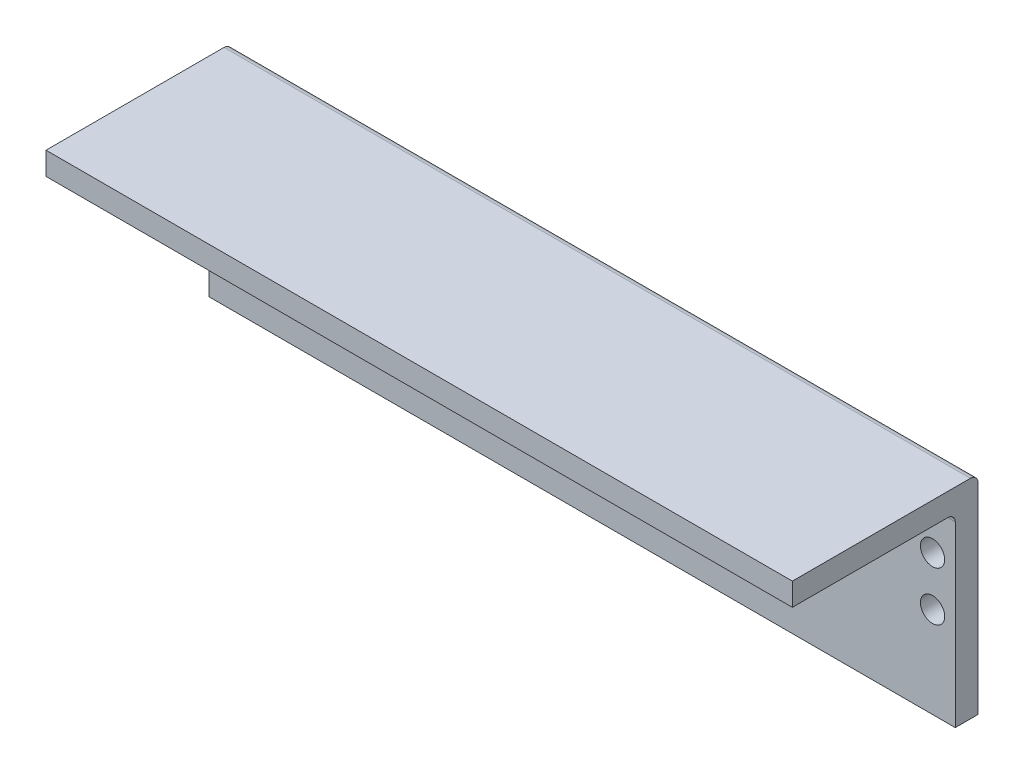
ISO-10303-21;
HEADER;
FILE_DESCRIPTION(('STEP AP214'),'2;1');
FILE_NAME('part.step','',(''),(''),'','','');
FILE_SCHEMA(('AUTOMOTIVE_DESIGN { 1 0 10303 214 1 1 1 1 }'));
ENDSEC;
DATA;
#1=APPLICATION_CONTEXT('core data for automotive mechanical design processes');
#2=APPLICATION_PROTOCOL_DEFINITION('international standard','automotive_design',2000,#1);
#3=PRODUCT_CONTEXT('',#1,'mechanical');
#4=PRODUCT('Part','Part','',(#3));
#5=PRODUCT_RELATED_PRODUCT_CATEGORY('part','',(#4));
#6=PRODUCT_DEFINITION_FORMATION('','',#4);
#7=PRODUCT_DEFINITION_CONTEXT('part definition',#1,'design');
#8=PRODUCT_DEFINITION('design','',#6,#7);
#9=PRODUCT_DEFINITION_SHAPE('','',#8);
#10=(LENGTH_UNIT() NAMED_UNIT(*) SI_UNIT(.MILLI.,.METRE.));
#11=(NAMED_UNIT(*) PLANE_ANGLE_UNIT() SI_UNIT($,.RADIAN.));
#12=(NAMED_UNIT(*) SI_UNIT($,.STERADIAN.) SOLID_ANGLE_UNIT());
#13=UNCERTAINTY_MEASURE_WITH_UNIT(LENGTH_MEASURE(1.E-05),#10,'distance_accuracy_value','');
#14=(GEOMETRIC_REPRESENTATION_CONTEXT(3) GLOBAL_UNCERTAINTY_ASSIGNED_CONTEXT((#13)) GLOBAL_UNIT_ASSIGNED_CONTEXT((#10,
#11,#12)) REPRESENTATION_CONTEXT('',''));
#15=CARTESIAN_POINT('',(0.,0.,0.));
#16=DIRECTION('',(0.,0.,1.));
#17=DIRECTION('',(1.,0.,0.));
#18=AXIS2_PLACEMENT_3D('',#15,#16,#17);
#19=CARTESIAN_POINT('',(0.,0.,3.));
#20=DIRECTION('',(0.,0.,-1.));
#21=DIRECTION('',(-1.,0.,0.));
#22=AXIS2_PLACEMENT_3D('',#19,#20,#21);
#23=PLANE('',#22);
#24=DIRECTION('',(0.,1.,0.));
#25=VECTOR('',#24,1.);
#26=CARTESIAN_POINT('',(49.2500000000016,0.,3.));
#27=LINE('',#26,#25);
#28=CARTESIAN_POINT('',(49.2500000000016,-9.,3.));
#29=VERTEX_POINT('',#28);
#30=CARTESIAN_POINT('',(49.2500000000016,14.5000000000001,3.));
#31=VERTEX_POINT('',#30);
#32=EDGE_CURVE('E202',#29,#31,#27,.T.);
#33=ORIENTED_EDGE('',*,*,#32,.T.);
#34=DIRECTION('',(-1.,0.,0.));
#35=VECTOR('',#34,1.);
#36=CARTESIAN_POINT('',(-49.2500000000016,14.5000000000001,3.));
#37=LINE('',#36,#35);
#38=CARTESIAN_POINT('',(-49.2500000000016,14.5000000000001,3.));
#39=VERTEX_POINT('',#38);
#40=EDGE_CURVE('E226',#31,#39,#37,.T.);
#41=ORIENTED_EDGE('',*,*,#40,.T.);
#42=DIRECTION('',(0.,-1.,0.));
#43=VECTOR('',#42,1.);
#44=CARTESIAN_POINT('',(-49.2500000000016,0.,3.));
#45=LINE('',#44,#43);
#46=CARTESIAN_POINT('',(-49.2500000000016,-9.,3.));
#47=VERTEX_POINT('',#46);
#48=EDGE_CURVE('E199',#39,#47,#45,.T.);
#49=ORIENTED_EDGE('',*,*,#48,.T.);
#50=DIRECTION('',(-1.,0.,0.));
#51=VECTOR('',#50,1.);
#52=CARTESIAN_POINT('',(49.2500000000016,-9.,3.));
#53=LINE('',#52,#51);
#54=EDGE_CURVE('E138',#29,#47,#53,.T.);
#55=ORIENTED_EDGE('',*,*,#54,.F.);
#56=EDGE_LOOP('',(#33,#41,#49,#55));
#57=FACE_BOUND('',#56,.T.);
#58=CARTESIAN_POINT('',(-46.2500000000013,3.,3.));
#59=DIRECTION('',(0.,0.,1.));
#60=DIRECTION('',(1.,0.,0.));
#61=AXIS2_PLACEMENT_3D('',#58,#59,#60);
#62=CIRCLE('',#61,1.6);
#63=CARTESIAN_POINT('',(-44.6500000000013,3.,3.));
#64=VERTEX_POINT('',#63);
#65=EDGE_CURVE('E122',#64,#64,#62,.T.);
#66=ORIENTED_EDGE('',*,*,#65,.F.);
#67=EDGE_LOOP('',(#66));
#68=FACE_BOUND('',#67,.T.);
#69=CARTESIAN_POINT('',(-46.2500000000013,9.50000000000001,3.));
#70=DIRECTION('',(0.,0.,1.));
#71=DIRECTION('',(1.,0.,0.));
#72=AXIS2_PLACEMENT_3D('',#69,#70,#71);
#73=CIRCLE('',#72,1.6);
#74=CARTESIAN_POINT('',(-44.6500000000013,9.50000000000001,3.));
#75=VERTEX_POINT('',#74);
#76=EDGE_CURVE('E185',#75,#75,#73,.T.);
#77=ORIENTED_EDGE('',*,*,#76,.F.);
#78=EDGE_LOOP('',(#77));
#79=FACE_BOUND('',#78,.T.);
#80=CARTESIAN_POINT('',(46.2500000000013,3.,3.));
#81=DIRECTION('',(0.,0.,1.));
#82=DIRECTION('',(1.,0.,0.));
#83=AXIS2_PLACEMENT_3D('',#80,#81,#82);
#84=CIRCLE('',#83,1.6);
#85=CARTESIAN_POINT('',(47.8500000000013,3.,3.));
#86=VERTEX_POINT('',#85);
#87=EDGE_CURVE('E177',#86,#86,#84,.T.);
#88=ORIENTED_EDGE('',*,*,#87,.F.);
#89=EDGE_LOOP('',(#88));
#90=FACE_BOUND('',#89,.T.);
#91=CARTESIAN_POINT('',(46.2500000000013,9.50000000000001,3.));
#92=DIRECTION('',(0.,0.,1.));
#93=DIRECTION('',(1.,0.,0.));
#94=AXIS2_PLACEMENT_3D('',#91,#92,#93);
#95=CIRCLE('',#94,1.6);
#96=CARTESIAN_POINT('',(47.8500000000013,9.50000000000001,3.));
#97=VERTEX_POINT('',#96);
#98=EDGE_CURVE('E169',#97,#97,#95,.T.);
#99=ORIENTED_EDGE('',*,*,#98,.F.);
#100=EDGE_LOOP('',(#99));
#101=FACE_BOUND('',#100,.T.);
#102=ADVANCED_FACE('F44',(#57,#68,#79,#90,#101),#23,.F.);
#103=CARTESIAN_POINT('',(0.,0.,0.));
#104=DIRECTION('',(0.,0.,-1.));
#105=DIRECTION('',(-1.,0.,0.));
#106=AXIS2_PLACEMENT_3D('',#103,#104,#105);
#107=PLANE('',#106);
#108=CARTESIAN_POINT('',(46.2500000000013,3.,0.));
#109=DIRECTION('',(0.,0.,1.));
#110=DIRECTION('',(1.,0.,0.));
#111=AXIS2_PLACEMENT_3D('',#108,#109,#110);
#112=CIRCLE('',#111,1.6);
#113=CARTESIAN_POINT('',(47.8500000000013,3.,0.));
#114=VERTEX_POINT('',#113);
#115=EDGE_CURVE('E173',#114,#114,#112,.T.);
#116=ORIENTED_EDGE('',*,*,#115,.T.);
#117=EDGE_LOOP('',(#116));
#118=FACE_BOUND('',#117,.T.);
#119=CARTESIAN_POINT('',(-46.2500000000013,3.,0.));
#120=DIRECTION('',(0.,0.,1.));
#121=DIRECTION('',(1.,0.,0.));
#122=AXIS2_PLACEMENT_3D('',#119,#120,#121);
#123=CIRCLE('',#122,1.6);
#124=CARTESIAN_POINT('',(-44.6500000000013,3.,0.));
#125=VERTEX_POINT('',#124);
#126=EDGE_CURVE('E189',#125,#125,#123,.T.);
#127=ORIENTED_EDGE('',*,*,#126,.T.);
#128=EDGE_LOOP('',(#127));
#129=FACE_BOUND('',#128,.T.);
#130=DIRECTION('',(0.,-1.,0.));
#131=VECTOR('',#130,1.);
#132=CARTESIAN_POINT('',(-49.2500000000016,0.,0.));
#133=LINE('',#132,#131);
#134=CARTESIAN_POINT('',(-49.2500000000016,17.5000000000001,0.));
#135=VERTEX_POINT('',#134);
#136=CARTESIAN_POINT('',(-49.2500000000016,-9.,0.));
#137=VERTEX_POINT('',#136);
#138=EDGE_CURVE('E110',#135,#137,#133,.T.);
#139=ORIENTED_EDGE('',*,*,#138,.F.);
#140=DIRECTION('',(-1.,0.,0.));
#141=VECTOR('',#140,1.);
#142=CARTESIAN_POINT('',(49.2500000000016,17.5000000000001,0.));
#143=LINE('',#142,#141);
#144=CARTESIAN_POINT('',(49.2500000000016,17.5000000000001,0.));
#145=VERTEX_POINT('',#144);
#146=EDGE_CURVE('E220',#135,#145,#143,.F.);
#147=ORIENTED_EDGE('',*,*,#146,.T.);
#148=DIRECTION('',(0.,1.,0.));
#149=VECTOR('',#148,1.);
#150=CARTESIAN_POINT('',(49.2500000000016,0.,0.));
#151=LINE('',#150,#149);
#152=CARTESIAN_POINT('',(49.2500000000016,-9.,0.));
#153=VERTEX_POINT('',#152);
#154=EDGE_CURVE('E121',#153,#145,#151,.T.);
#155=ORIENTED_EDGE('',*,*,#154,.F.);
#156=DIRECTION('',(1.,0.,0.));
#157=VECTOR('',#156,1.);
#158=CARTESIAN_POINT('',(-49.2500000000016,-9.,0.));
#159=LINE('',#158,#157);
#160=EDGE_CURVE('E125',#137,#153,#159,.T.);
#161=ORIENTED_EDGE('',*,*,#160,.F.);
#162=EDGE_LOOP('',(#139,#147,#155,#161));
#163=FACE_BOUND('',#162,.T.);
#164=CARTESIAN_POINT('',(-46.2500000000013,9.50000000000001,0.));
#165=DIRECTION('',(0.,0.,1.));
#166=DIRECTION('',(1.,0.,0.));
#167=AXIS2_PLACEMENT_3D('',#164,#165,#166);
#168=CIRCLE('',#167,1.6);
#169=CARTESIAN_POINT('',(-44.6500000000013,9.50000000000001,0.));
#170=VERTEX_POINT('',#169);
#171=EDGE_CURVE('E181',#170,#170,#168,.T.);
#172=ORIENTED_EDGE('',*,*,#171,.T.);
#173=EDGE_LOOP('',(#172));
#174=FACE_BOUND('',#173,.T.);
#175=CARTESIAN_POINT('',(46.2500000000013,9.50000000000001,0.));
#176=DIRECTION('',(0.,0.,1.));
#177=DIRECTION('',(1.,0.,0.));
#178=AXIS2_PLACEMENT_3D('',#175,#176,#177);
#179=CIRCLE('',#178,1.6);
#180=CARTESIAN_POINT('',(47.8500000000013,9.50000000000001,0.));
#181=VERTEX_POINT('',#180);
#182=EDGE_CURVE('E165',#181,#181,#179,.T.);
#183=ORIENTED_EDGE('',*,*,#182,.T.);
#184=EDGE_LOOP('',(#183));
#185=FACE_BOUND('',#184,.T.);
#186=ADVANCED_FACE('F126',(#118,#129,#163,#174,#185),#107,.T.);
#187=CARTESIAN_POINT('',(-49.2500000000016,0.,3.));
#188=DIRECTION('',(1.,0.,0.));
#189=DIRECTION('',(0.,1.,0.));
#190=AXIS2_PLACEMENT_3D('',#187,#188,#189);
#191=PLANE('',#190);
#192=DIRECTION('',(0.,0.,-1.));
#193=VECTOR('',#192,1.);
#194=CARTESIAN_POINT('',(-49.2500000000016,18.5000000000001,3.));
#195=LINE('',#194,#193);
#196=CARTESIAN_POINT('',(-49.2500000000016,18.5000000000001,24.5));
#197=VERTEX_POINT('',#196);
#198=CARTESIAN_POINT('',(-49.2500000000016,18.5000000000001,1.));
#199=VERTEX_POINT('',#198);
#200=EDGE_CURVE('E204',#197,#199,#195,.T.);
#201=ORIENTED_EDGE('',*,*,#200,.T.);
#202=CARTESIAN_POINT('',(-49.2500000000016,17.5000000000001,1.));
#203=DIRECTION('',(1.,0.,0.));
#204=DIRECTION('',(0.,1.,0.));
#205=AXIS2_PLACEMENT_3D('',#202,#203,#204);
#206=CIRCLE('',#205,1.);
#207=EDGE_CURVE('E117',#199,#135,#206,.F.);
#208=ORIENTED_EDGE('',*,*,#207,.T.);
#209=ORIENTED_EDGE('',*,*,#138,.T.);
#210=DIRECTION('',(0.,0.,-1.));
#211=VECTOR('',#210,1.);
#212=CARTESIAN_POINT('',(-49.2500000000016,-9.,3.));
#213=LINE('',#212,#211);
#214=EDGE_CURVE('E116',#47,#137,#213,.T.);
#215=ORIENTED_EDGE('',*,*,#214,.F.);
#216=ORIENTED_EDGE('',*,*,#48,.F.);
#217=CARTESIAN_POINT('',(-49.2500000000016,14.5000000000001,4.));
#218=DIRECTION('',(1.,0.,0.));
#219=DIRECTION('',(0.,1.,0.));
#220=AXIS2_PLACEMENT_3D('',#217,#218,#219);
#221=CIRCLE('',#220,1.);
#222=CARTESIAN_POINT('',(-49.2500000000016,15.5000000000001,4.));
#223=VERTEX_POINT('',#222);
#224=EDGE_CURVE('E53',#39,#223,#221,.T.);
#225=ORIENTED_EDGE('',*,*,#224,.T.);
#226=DIRECTION('',(0.,0.,1.));
#227=VECTOR('',#226,1.);
#228=CARTESIAN_POINT('',(-49.2500000000016,15.5000000000001,3.));
#229=LINE('',#228,#227);
#230=CARTESIAN_POINT('',(-49.2500000000016,15.5000000000001,24.5));
#231=VERTEX_POINT('',#230);
#232=EDGE_CURVE('E147',#223,#231,#229,.T.);
#233=ORIENTED_EDGE('',*,*,#232,.T.);
#234=DIRECTION('',(0.,1.,0.));
#235=VECTOR('',#234,1.);
#236=CARTESIAN_POINT('',(-49.2500000000016,15.5000000000001,24.5));
#237=LINE('',#236,#235);
#238=EDGE_CURVE('E157',#231,#197,#237,.T.);
#239=ORIENTED_EDGE('',*,*,#238,.T.);
#240=EDGE_LOOP('',(#201,#208,#209,#215,#216,#225,#233,#239));
#241=FACE_BOUND('',#240,.T.);
#242=ADVANCED_FACE('F113',(#241),#191,.F.);
#243=CARTESIAN_POINT('',(49.2500000000016,0.,3.));
#244=DIRECTION('',(-1.,0.,0.));
#245=DIRECTION('',(0.,-1.,0.));
#246=AXIS2_PLACEMENT_3D('',#243,#244,#245);
#247=PLANE('',#246);
#248=ORIENTED_EDGE('',*,*,#154,.T.);
#249=CARTESIAN_POINT('',(49.2500000000016,17.5000000000001,1.));
#250=DIRECTION('',(-1.,0.,0.));
#251=DIRECTION('',(0.,-1.,0.));
#252=AXIS2_PLACEMENT_3D('',#249,#250,#251);
#253=CIRCLE('',#252,1.);
#254=CARTESIAN_POINT('',(49.2500000000016,18.5000000000001,1.));
#255=VERTEX_POINT('',#254);
#256=EDGE_CURVE('E223',#145,#255,#253,.F.);
#257=ORIENTED_EDGE('',*,*,#256,.T.);
#258=DIRECTION('',(0.,0.,-1.));
#259=VECTOR('',#258,1.);
#260=CARTESIAN_POINT('',(49.2500000000016,18.5000000000001,3.));
#261=LINE('',#260,#259);
#262=CARTESIAN_POINT('',(49.2500000000016,18.5000000000001,24.5));
#263=VERTEX_POINT('',#262);
#264=EDGE_CURVE('E210',#263,#255,#261,.T.);
#265=ORIENTED_EDGE('',*,*,#264,.F.);
#266=DIRECTION('',(0.,1.,0.));
#267=VECTOR('',#266,1.);
#268=CARTESIAN_POINT('',(49.2500000000016,15.5000000000001,24.5));
#269=LINE('',#268,#267);
#270=CARTESIAN_POINT('',(49.2500000000016,15.5000000000001,24.5));
#271=VERTEX_POINT('',#270);
#272=EDGE_CURVE('E161',#271,#263,#269,.T.);
#273=ORIENTED_EDGE('',*,*,#272,.F.);
#274=DIRECTION('',(0.,0.,-1.));
#275=VECTOR('',#274,1.);
#276=CARTESIAN_POINT('',(49.2500000000016,15.5000000000001,3.));
#277=LINE('',#276,#275);
#278=CARTESIAN_POINT('',(49.2500000000016,15.5000000000001,4.));
#279=VERTEX_POINT('',#278);
#280=EDGE_CURVE('E154',#271,#279,#277,.T.);
#281=ORIENTED_EDGE('',*,*,#280,.T.);
#282=CARTESIAN_POINT('',(49.2500000000016,14.5000000000001,4.));
#283=DIRECTION('',(-1.,0.,0.));
#284=DIRECTION('',(0.,-1.,0.));
#285=AXIS2_PLACEMENT_3D('',#282,#283,#284);
#286=CIRCLE('',#285,1.);
#287=EDGE_CURVE('E11',#279,#31,#286,.T.);
#288=ORIENTED_EDGE('',*,*,#287,.T.);
#289=ORIENTED_EDGE('',*,*,#32,.F.);
#290=DIRECTION('',(0.,0.,1.));
#291=VECTOR('',#290,1.);
#292=CARTESIAN_POINT('',(49.2500000000016,-9.,0.));
#293=LINE('',#292,#291);
#294=EDGE_CURVE('E133',#153,#29,#293,.T.);
#295=ORIENTED_EDGE('',*,*,#294,.F.);
#296=EDGE_LOOP('',(#248,#257,#265,#273,#281,#288,#289,#295));
#297=FACE_BOUND('',#296,.T.);
#298=ADVANCED_FACE('F239',(#297),#247,.F.);
#299=CARTESIAN_POINT('',(-49.2500000000016,18.5000000000001,3.));
#300=DIRECTION('',(0.,-1.,0.));
#301=DIRECTION('',(0.,0.,-1.));
#302=AXIS2_PLACEMENT_3D('',#299,#300,#301);
#303=PLANE('',#302);
#304=ORIENTED_EDGE('',*,*,#264,.T.);
#305=DIRECTION('',(-1.,0.,0.));
#306=VECTOR('',#305,1.);
#307=CARTESIAN_POINT('',(-49.2500000000016,18.5000000000001,1.));
#308=LINE('',#307,#306);
#309=EDGE_CURVE('E214',#255,#199,#308,.T.);
#310=ORIENTED_EDGE('',*,*,#309,.T.);
#311=ORIENTED_EDGE('',*,*,#200,.F.);
#312=DIRECTION('',(1.,0.,0.));
#313=VECTOR('',#312,1.);
#314=CARTESIAN_POINT('',(-49.2500000000016,18.5000000000001,24.5));
#315=LINE('',#314,#313);
#316=EDGE_CURVE('E146',#197,#263,#315,.T.);
#317=ORIENTED_EDGE('',*,*,#316,.T.);
#318=EDGE_LOOP('',(#304,#310,#311,#317));
#319=FACE_BOUND('',#318,.T.);
#320=ADVANCED_FACE('F245',(#319),#303,.F.);
#321=CARTESIAN_POINT('',(-46.2500000000013,3.,3.));
#322=DIRECTION('',(0.,0.,-1.));
#323=DIRECTION('',(-1.,0.,0.));
#324=AXIS2_PLACEMENT_3D('',#321,#322,#323);
#325=CYLINDRICAL_SURFACE('',#324,1.6);
#326=ORIENTED_EDGE('',*,*,#65,.T.);
#327=EDGE_LOOP('',(#326));
#328=FACE_BOUND('',#327,.T.);
#329=ORIENTED_EDGE('',*,*,#126,.F.);
#330=EDGE_LOOP('',(#329));
#331=FACE_BOUND('',#330,.T.);
#332=ADVANCED_FACE('F268',(#328,#331),#325,.F.);
#333=CARTESIAN_POINT('',(-46.2500000000013,9.50000000000001,3.));
#334=DIRECTION('',(0.,0.,-1.));
#335=DIRECTION('',(-1.,0.,0.));
#336=AXIS2_PLACEMENT_3D('',#333,#334,#335);
#337=CYLINDRICAL_SURFACE('',#336,1.6);
#338=ORIENTED_EDGE('',*,*,#76,.T.);
#339=EDGE_LOOP('',(#338));
#340=FACE_BOUND('',#339,.T.);
#341=ORIENTED_EDGE('',*,*,#171,.F.);
#342=EDGE_LOOP('',(#341));
#343=FACE_BOUND('',#342,.T.);
#344=ADVANCED_FACE('F359',(#340,#343),#337,.F.);
#345=CARTESIAN_POINT('',(46.2500000000013,3.,3.));
#346=DIRECTION('',(0.,0.,-1.));
#347=DIRECTION('',(-1.,0.,0.));
#348=AXIS2_PLACEMENT_3D('',#345,#346,#347);
#349=CYLINDRICAL_SURFACE('',#348,1.6);
#350=ORIENTED_EDGE('',*,*,#87,.T.);
#351=EDGE_LOOP('',(#350));
#352=FACE_BOUND('',#351,.T.);
#353=ORIENTED_EDGE('',*,*,#115,.F.);
#354=EDGE_LOOP('',(#353));
#355=FACE_BOUND('',#354,.T.);
#356=ADVANCED_FACE('F257',(#352,#355),#349,.F.);
#357=CARTESIAN_POINT('',(46.2500000000013,9.50000000000001,3.));
#358=DIRECTION('',(0.,0.,-1.));
#359=DIRECTION('',(-1.,0.,0.));
#360=AXIS2_PLACEMENT_3D('',#357,#358,#359);
#361=CYLINDRICAL_SURFACE('',#360,1.6);
#362=ORIENTED_EDGE('',*,*,#98,.T.);
#363=EDGE_LOOP('',(#362));
#364=FACE_BOUND('',#363,.T.);
#365=ORIENTED_EDGE('',*,*,#182,.F.);
#366=EDGE_LOOP('',(#365));
#367=FACE_BOUND('',#366,.T.);
#368=ADVANCED_FACE('F250',(#364,#367),#361,.F.);
#369=CARTESIAN_POINT('',(-49.2500000000016,15.5000000000001,24.5));
#370=DIRECTION('',(0.,0.,1.));
#371=DIRECTION('',(1.,0.,0.));
#372=AXIS2_PLACEMENT_3D('',#369,#370,#371);
#373=PLANE('',#372);
#374=ORIENTED_EDGE('',*,*,#316,.F.);
#375=ORIENTED_EDGE('',*,*,#238,.F.);
#376=DIRECTION('',(1.,0.,0.));
#377=VECTOR('',#376,1.);
#378=CARTESIAN_POINT('',(-49.2500000000016,15.5000000000001,24.5));
#379=LINE('',#378,#377);
#380=EDGE_CURVE('E150',#231,#271,#379,.T.);
#381=ORIENTED_EDGE('',*,*,#380,.T.);
#382=ORIENTED_EDGE('',*,*,#272,.T.);
#383=EDGE_LOOP('',(#374,#375,#381,#382));
#384=FACE_BOUND('',#383,.T.);
#385=ADVANCED_FACE('F248',(#384),#373,.T.);
#386=CARTESIAN_POINT('',(0.,15.5000000000001,0.));
#387=DIRECTION('',(0.,1.,0.));
#388=DIRECTION('',(0.,0.,1.));
#389=AXIS2_PLACEMENT_3D('',#386,#387,#388);
#390=PLANE('',#389);
#391=ORIENTED_EDGE('',*,*,#232,.F.);
#392=DIRECTION('',(-1.,0.,0.));
#393=VECTOR('',#392,1.);
#394=CARTESIAN_POINT('',(49.2500000000016,15.5000000000001,4.));
#395=LINE('',#394,#393);
#396=EDGE_CURVE('E66',#223,#279,#395,.F.);
#397=ORIENTED_EDGE('',*,*,#396,.T.);
#398=ORIENTED_EDGE('',*,*,#280,.F.);
#399=ORIENTED_EDGE('',*,*,#380,.F.);
#400=EDGE_LOOP('',(#391,#397,#398,#399));
#401=FACE_BOUND('',#400,.T.);
#402=ADVANCED_FACE('F236',(#401),#390,.F.);
#403=CARTESIAN_POINT('',(-49.2500000000016,17.5000000000001,1.));
#404=DIRECTION('',(1.,0.,0.));
#405=DIRECTION('',(0.,0.,-1.));
#406=AXIS2_PLACEMENT_3D('',#403,#404,#405);
#407=CYLINDRICAL_SURFACE('',#406,1.);
#408=ORIENTED_EDGE('',*,*,#256,.F.);
#409=ORIENTED_EDGE('',*,*,#146,.F.);
#410=ORIENTED_EDGE('',*,*,#207,.F.);
#411=ORIENTED_EDGE('',*,*,#309,.F.);
#412=EDGE_LOOP('',(#408,#409,#410,#411));
#413=FACE_BOUND('',#412,.T.);
#414=ADVANCED_FACE('F243',(#413),#407,.T.);
#415=CARTESIAN_POINT('',(0.,14.5000000000001,4.));
#416=DIRECTION('',(1.,0.,0.));
#417=DIRECTION('',(0.,0.,-1.));
#418=AXIS2_PLACEMENT_3D('',#415,#416,#417);
#419=CYLINDRICAL_SURFACE('',#418,1.);
#420=ORIENTED_EDGE('',*,*,#287,.F.);
#421=ORIENTED_EDGE('',*,*,#396,.F.);
#422=ORIENTED_EDGE('',*,*,#224,.F.);
#423=ORIENTED_EDGE('',*,*,#40,.F.);
#424=EDGE_LOOP('',(#420,#421,#422,#423));
#425=FACE_BOUND('',#424,.T.);
#426=ADVANCED_FACE('F46',(#425),#419,.F.);
#427=CARTESIAN_POINT('',(0.,-9.,0.));
#428=DIRECTION('',(0.,-1.,0.));
#429=DIRECTION('',(0.,0.,-1.));
#430=AXIS2_PLACEMENT_3D('',#427,#428,#429);
#431=PLANE('',#430);
#432=ORIENTED_EDGE('',*,*,#214,.T.);
#433=ORIENTED_EDGE('',*,*,#160,.T.);
#434=ORIENTED_EDGE('',*,*,#294,.T.);
#435=ORIENTED_EDGE('',*,*,#54,.T.);
#436=EDGE_LOOP('',(#432,#433,#434,#435));
#437=FACE_BOUND('',#436,.T.);
#438=ADVANCED_FACE('F136',(#437),#431,.T.);
#439=CLOSED_SHELL('',(#102,#186,#242,#298,#320,#332,#344,#356,#368,#385,#402,#414,#426,#438));
#440=MANIFOLD_SOLID_BREP('B2',#439);
#441=ADVANCED_BREP_SHAPE_REPRESENTATION('',(#18,#440),#14);
#442=SHAPE_DEFINITION_REPRESENTATION(#9,#441);
ENDSEC;
END-ISO-10303-21;
